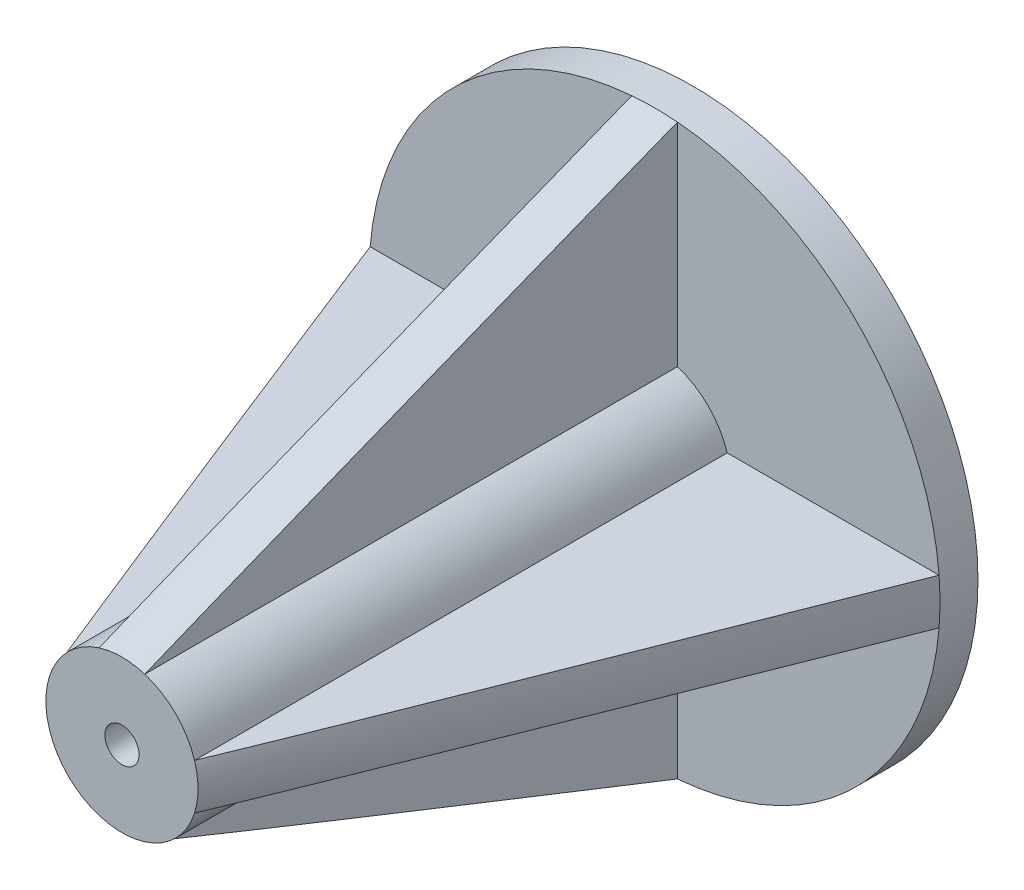
ISO-10303-21;
HEADER;
FILE_DESCRIPTION(('STEP AP214'),'2;1');
FILE_NAME('part.step','',(''),(''),'','','');
FILE_SCHEMA(('AUTOMOTIVE_DESIGN { 1 0 10303 214 1 1 1 1 }'));
ENDSEC;
DATA;
#1=APPLICATION_CONTEXT('core data for automotive mechanical design processes');
#2=APPLICATION_PROTOCOL_DEFINITION('international standard','automotive_design',2000,#1);
#3=PRODUCT_CONTEXT('',#1,'mechanical');
#4=PRODUCT('Part','Part','',(#3));
#5=PRODUCT_RELATED_PRODUCT_CATEGORY('part','',(#4));
#6=PRODUCT_DEFINITION_FORMATION('','',#4);
#7=PRODUCT_DEFINITION_CONTEXT('part definition',#1,'design');
#8=PRODUCT_DEFINITION('design','',#6,#7);
#9=PRODUCT_DEFINITION_SHAPE('','',#8);
#10=(LENGTH_UNIT() NAMED_UNIT(*) SI_UNIT(.MILLI.,.METRE.));
#11=(NAMED_UNIT(*) PLANE_ANGLE_UNIT() SI_UNIT($,.RADIAN.));
#12=(NAMED_UNIT(*) SI_UNIT($,.STERADIAN.) SOLID_ANGLE_UNIT());
#13=UNCERTAINTY_MEASURE_WITH_UNIT(LENGTH_MEASURE(1.E-05),#10,'distance_accuracy_value','');
#14=(GEOMETRIC_REPRESENTATION_CONTEXT(3) GLOBAL_UNCERTAINTY_ASSIGNED_CONTEXT((#13)) GLOBAL_UNIT_ASSIGNED_CONTEXT((#10,
#11,#12)) REPRESENTATION_CONTEXT('',''));
#15=CARTESIAN_POINT('',(0.,0.,0.));
#16=DIRECTION('',(0.,0.,1.));
#17=DIRECTION('',(1.,0.,0.));
#18=AXIS2_PLACEMENT_3D('',#15,#16,#17);
#19=CARTESIAN_POINT('',(0.,0.,2.));
#20=DIRECTION('',(0.,0.,1.));
#21=DIRECTION('',(1.,0.,0.));
#22=AXIS2_PLACEMENT_3D('',#19,#20,#21);
#23=PLANE('',#22);
#24=CARTESIAN_POINT('',(0.,0.,2.));
#25=DIRECTION('',(0.,0.,1.));
#26=DIRECTION('',(1.,0.,0.));
#27=AXIS2_PLACEMENT_3D('',#24,#25,#26);
#28=CIRCLE('',#27,4.);
#29=CARTESIAN_POINT('',(-1.20000000000005,-3.81575680566777,2.));
#30=VERTEX_POINT('',#29);
#31=CARTESIAN_POINT('',(-3.81575680566778,-1.20000000000001,2.));
#32=VERTEX_POINT('',#31);
#33=EDGE_CURVE('E451',#30,#32,#28,.F.);
#34=ORIENTED_EDGE('',*,*,#33,.T.);
#35=DIRECTION('',(1.,0.,0.));
#36=VECTOR('',#35,1.);
#37=CARTESIAN_POINT('',(0.,-1.19999999999995,2.));
#38=LINE('',#37,#36);
#39=CARTESIAN_POINT('',(-14.9519229532525,-1.20000000000018,2.));
#40=VERTEX_POINT('',#39);
#41=EDGE_CURVE('E184',#40,#32,#38,.T.);
#42=ORIENTED_EDGE('',*,*,#41,.F.);
#43=CARTESIAN_POINT('',(0.,0.,2.));
#44=DIRECTION('',(0.,0.,1.));
#45=DIRECTION('',(1.,0.,0.));
#46=AXIS2_PLACEMENT_3D('',#43,#44,#45);
#47=CIRCLE('',#46,15.);
#48=CARTESIAN_POINT('',(-1.19999999999972,-14.9519229532526,2.));
#49=VERTEX_POINT('',#48);
#50=EDGE_CURVE('E258',#40,#49,#47,.T.);
#51=ORIENTED_EDGE('',*,*,#50,.T.);
#52=DIRECTION('',(0.,1.,0.));
#53=VECTOR('',#52,1.);
#54=CARTESIAN_POINT('',(-1.20000000000016,0.,2.));
#55=LINE('',#54,#53);
#56=EDGE_CURVE('E190',#49,#30,#55,.T.);
#57=ORIENTED_EDGE('',*,*,#56,.T.);
#58=EDGE_LOOP('',(#34,#42,#51,#57));
#59=FACE_BOUND('',#58,.T.);
#60=ADVANCED_FACE('F53',(#59),#23,.T.);
#61=CARTESIAN_POINT('',(0.,0.,30.));
#62=DIRECTION('',(0.,0.,-1.));
#63=DIRECTION('',(-1.,0.,0.));
#64=AXIS2_PLACEMENT_3D('',#61,#62,#63);
#65=CYLINDRICAL_SURFACE('',#64,4.);
#66=DIRECTION('',(0.,0.,-1.));
#67=VECTOR('',#66,1.);
#68=CARTESIAN_POINT('',(-3.81575680566778,-1.20000000000001,41.4388502844459));
#69=LINE('',#68,#67);
#70=CARTESIAN_POINT('',(-3.81575680566778,-1.20000000000001,30.));
#71=VERTEX_POINT('',#70);
#72=EDGE_CURVE('E175',#71,#32,#69,.T.);
#73=ORIENTED_EDGE('',*,*,#72,.T.);
#74=ORIENTED_EDGE('',*,*,#33,.F.);
#75=DIRECTION('',(0.,0.,-1.));
#76=VECTOR('',#75,1.);
#77=CARTESIAN_POINT('',(-1.20000000000005,-3.81575680566777,41.4388502844459));
#78=LINE('',#77,#76);
#79=CARTESIAN_POINT('',(-1.20000000000005,-3.81575680566777,30.));
#80=VERTEX_POINT('',#79);
#81=EDGE_CURVE('E178',#80,#30,#78,.T.);
#82=ORIENTED_EDGE('',*,*,#81,.F.);
#83=CARTESIAN_POINT('',(0.,0.,30.));
#84=DIRECTION('',(0.,0.,1.));
#85=DIRECTION('',(1.,0.,0.));
#86=AXIS2_PLACEMENT_3D('',#83,#84,#85);
#87=CIRCLE('',#86,4.);
#88=EDGE_CURVE('E164',#71,#80,#87,.T.);
#89=ORIENTED_EDGE('',*,*,#88,.F.);
#90=EDGE_LOOP('',(#73,#74,#82,#89));
#91=FACE_BOUND('',#90,.T.);
#92=ADVANCED_FACE('F173',(#91),#65,.T.);
#93=CARTESIAN_POINT('',(3.81575680566777,-1.20000000000005,2.));
#94=VERTEX_POINT('',#93);
#95=CARTESIAN_POINT('',(1.19999999999995,-3.8157568056678,2.));
#96=VERTEX_POINT('',#95);
#97=EDGE_CURVE('E249',#94,#96,#28,.F.);
#98=ORIENTED_EDGE('',*,*,#97,.T.);
#99=DIRECTION('',(0.,1.,0.));
#100=VECTOR('',#99,1.);
#101=CARTESIAN_POINT('',(1.19999999999984,0.,2.));
#102=LINE('',#101,#100);
#103=CARTESIAN_POINT('',(1.20000000000028,-14.9519229532525,2.));
#104=VERTEX_POINT('',#103);
#105=EDGE_CURVE('E199',#104,#96,#102,.T.);
#106=ORIENTED_EDGE('',*,*,#105,.F.);
#107=CARTESIAN_POINT('',(14.9519229532525,-1.20000000000005,2.));
#108=VERTEX_POINT('',#107);
#109=EDGE_CURVE('E427',#104,#108,#47,.T.);
#110=ORIENTED_EDGE('',*,*,#109,.T.);
#111=DIRECTION('',(-1.,0.,0.));
#112=VECTOR('',#111,1.);
#113=CARTESIAN_POINT('',(0.,-1.20000000000005,2.));
#114=LINE('',#113,#112);
#115=EDGE_CURVE('E203',#108,#94,#114,.T.);
#116=ORIENTED_EDGE('',*,*,#115,.T.);
#117=EDGE_LOOP('',(#98,#106,#110,#116));
#118=FACE_BOUND('',#117,.T.);
#119=ADVANCED_FACE('F357',(#118),#23,.T.);
#120=DIRECTION('',(0.,0.,-1.));
#121=VECTOR('',#120,1.);
#122=CARTESIAN_POINT('',(1.19999999999996,-3.8157568056678,41.4388502844459));
#123=LINE('',#122,#121);
#124=CARTESIAN_POINT('',(1.19999999999996,-3.8157568056678,30.));
#125=VERTEX_POINT('',#124);
#126=EDGE_CURVE('E204',#125,#96,#123,.T.);
#127=ORIENTED_EDGE('',*,*,#126,.T.);
#128=ORIENTED_EDGE('',*,*,#97,.F.);
#129=DIRECTION('',(0.,0.,-1.));
#130=VECTOR('',#129,1.);
#131=CARTESIAN_POINT('',(3.81575680566777,-1.20000000000005,41.4388502844459));
#132=LINE('',#131,#130);
#133=CARTESIAN_POINT('',(3.81575680566777,-1.20000000000005,30.));
#134=VERTEX_POINT('',#133);
#135=EDGE_CURVE('E211',#134,#94,#132,.T.);
#136=ORIENTED_EDGE('',*,*,#135,.F.);
#137=EDGE_CURVE('E181',#125,#134,#87,.T.);
#138=ORIENTED_EDGE('',*,*,#137,.F.);
#139=EDGE_LOOP('',(#127,#128,#136,#138));
#140=FACE_BOUND('',#139,.T.);
#141=ADVANCED_FACE('F361',(#140),#65,.T.);
#142=CARTESIAN_POINT('',(1.2,3.81575680566778,2.));
#143=VERTEX_POINT('',#142);
#144=CARTESIAN_POINT('',(3.8157568056678,1.19999999999995,2.));
#145=VERTEX_POINT('',#144);
#146=EDGE_CURVE('E244',#143,#145,#28,.F.);
#147=ORIENTED_EDGE('',*,*,#146,.T.);
#148=DIRECTION('',(-1.,0.,0.));
#149=VECTOR('',#148,1.);
#150=CARTESIAN_POINT('',(0.,1.19999999999995,2.));
#151=LINE('',#150,#149);
#152=CARTESIAN_POINT('',(14.9519229532525,1.19999999999995,2.));
#153=VERTEX_POINT('',#152);
#154=EDGE_CURVE('E212',#153,#145,#151,.T.);
#155=ORIENTED_EDGE('',*,*,#154,.F.);
#156=CARTESIAN_POINT('',(1.2,14.9519229532525,2.));
#157=VERTEX_POINT('',#156);
#158=EDGE_CURVE('E259',#153,#157,#47,.T.);
#159=ORIENTED_EDGE('',*,*,#158,.T.);
#160=DIRECTION('',(0.,-1.,0.));
#161=VECTOR('',#160,1.);
#162=CARTESIAN_POINT('',(1.2,0.,2.));
#163=LINE('',#162,#161);
#164=EDGE_CURVE('E228',#157,#143,#163,.T.);
#165=ORIENTED_EDGE('',*,*,#164,.T.);
#166=EDGE_LOOP('',(#147,#155,#159,#165));
#167=FACE_BOUND('',#166,.T.);
#168=ADVANCED_FACE('F348',(#167),#23,.T.);
#169=DIRECTION('',(0.,0.,-1.));
#170=VECTOR('',#169,1.);
#171=CARTESIAN_POINT('',(3.8157568056678,1.19999999999995,41.4388502844459));
#172=LINE('',#171,#170);
#173=CARTESIAN_POINT('',(3.8157568056678,1.19999999999995,30.));
#174=VERTEX_POINT('',#173);
#175=EDGE_CURVE('E217',#174,#145,#172,.T.);
#176=ORIENTED_EDGE('',*,*,#175,.T.);
#177=ORIENTED_EDGE('',*,*,#146,.F.);
#178=DIRECTION('',(0.,0.,-1.));
#179=VECTOR('',#178,1.);
#180=CARTESIAN_POINT('',(1.2,3.81575680566778,41.4388502844459));
#181=LINE('',#180,#179);
#182=CARTESIAN_POINT('',(1.2,3.81575680566778,30.));
#183=VERTEX_POINT('',#182);
#184=EDGE_CURVE('E216',#183,#143,#181,.T.);
#185=ORIENTED_EDGE('',*,*,#184,.F.);
#186=EDGE_CURVE('E240',#174,#183,#87,.T.);
#187=ORIENTED_EDGE('',*,*,#186,.F.);
#188=EDGE_LOOP('',(#176,#177,#185,#187));
#189=FACE_BOUND('',#188,.T.);
#190=ADVANCED_FACE('F338',(#189),#65,.T.);
#191=DIRECTION('',(1.,0.,0.));
#192=VECTOR('',#191,1.);
#193=CARTESIAN_POINT('',(0.,1.20000000000005,2.));
#194=LINE('',#193,#192);
#195=CARTESIAN_POINT('',(-14.9519229532525,1.19999999999982,2.));
#196=VERTEX_POINT('',#195);
#197=CARTESIAN_POINT('',(-3.81575680566778,1.2,2.));
#198=VERTEX_POINT('',#197);
#199=EDGE_CURVE('E193',#196,#198,#194,.T.);
#200=ORIENTED_EDGE('',*,*,#199,.T.);
#201=CARTESIAN_POINT('',(-1.2,3.81575680566778,2.));
#202=VERTEX_POINT('',#201);
#203=EDGE_CURVE('E243',#198,#202,#28,.F.);
#204=ORIENTED_EDGE('',*,*,#203,.T.);
#205=DIRECTION('',(0.,-1.,0.));
#206=VECTOR('',#205,1.);
#207=CARTESIAN_POINT('',(-1.2,0.,2.));
#208=LINE('',#207,#206);
#209=CARTESIAN_POINT('',(-1.2,14.9519229532525,2.));
#210=VERTEX_POINT('',#209);
#211=EDGE_CURVE('E223',#210,#202,#208,.T.);
#212=ORIENTED_EDGE('',*,*,#211,.F.);
#213=EDGE_CURVE('E254',#210,#196,#47,.T.);
#214=ORIENTED_EDGE('',*,*,#213,.T.);
#215=EDGE_LOOP('',(#200,#204,#212,#214));
#216=FACE_BOUND('',#215,.T.);
#217=ADVANCED_FACE('F343',(#216),#23,.T.);
#218=CARTESIAN_POINT('',(0.,0.,0.));
#219=DIRECTION('',(0.,0.,1.));
#220=DIRECTION('',(1.,0.,0.));
#221=AXIS2_PLACEMENT_3D('',#218,#219,#220);
#222=PLANE('',#221);
#223=CARTESIAN_POINT('',(0.,0.,0.));
#224=DIRECTION('',(0.,0.,1.));
#225=DIRECTION('',(1.,0.,0.));
#226=AXIS2_PLACEMENT_3D('',#223,#224,#225);
#227=CIRCLE('',#226,0.9);
#228=CARTESIAN_POINT('',(0.9,0.,0.));
#229=VERTEX_POINT('',#228);
#230=EDGE_CURVE('E248',#229,#229,#227,.T.);
#231=ORIENTED_EDGE('',*,*,#230,.T.);
#232=EDGE_LOOP('',(#231));
#233=FACE_BOUND('',#232,.T.);
#234=CARTESIAN_POINT('',(0.,0.,0.));
#235=DIRECTION('',(0.,0.,1.));
#236=DIRECTION('',(1.,0.,0.));
#237=AXIS2_PLACEMENT_3D('',#234,#235,#236);
#238=CIRCLE('',#237,15.);
#239=CARTESIAN_POINT('',(15.,0.,0.));
#240=VERTEX_POINT('',#239);
#241=EDGE_CURVE('E253',#240,#240,#238,.T.);
#242=ORIENTED_EDGE('',*,*,#241,.F.);
#243=EDGE_LOOP('',(#242));
#244=FACE_BOUND('',#243,.T.);
#245=ADVANCED_FACE('F346',(#233,#244),#222,.F.);
#246=CARTESIAN_POINT('',(0.,0.,2.));
#247=DIRECTION('',(0.,0.,-1.));
#248=DIRECTION('',(-1.,0.,0.));
#249=AXIS2_PLACEMENT_3D('',#246,#247,#248);
#250=CYLINDRICAL_SURFACE('',#249,15.);
#251=ORIENTED_EDGE('',*,*,#50,.F.);
#252=CARTESIAN_POINT('',(0.,0.,1.99999999999975));
#253=DIRECTION('',(0.,0.,1.));
#254=DIRECTION('',(1.,0.,0.));
#255=AXIS2_PLACEMENT_3D('',#252,#253,#254);
#256=CIRCLE('',#255,15.);
#257=EDGE_CURVE('E83',#40,#196,#256,.F.);
#258=ORIENTED_EDGE('',*,*,#257,.T.);
#259=ORIENTED_EDGE('',*,*,#213,.F.);
#260=CARTESIAN_POINT('',(0.,0.,1.99999999999976));
#261=DIRECTION('',(0.,0.,1.));
#262=DIRECTION('',(1.,0.,0.));
#263=AXIS2_PLACEMENT_3D('',#260,#261,#262);
#264=CIRCLE('',#263,15.);
#265=EDGE_CURVE('E438',#210,#157,#264,.F.);
#266=ORIENTED_EDGE('',*,*,#265,.T.);
#267=ORIENTED_EDGE('',*,*,#158,.F.);
#268=CARTESIAN_POINT('',(0.,0.,1.99999999999975));
#269=DIRECTION('',(0.,0.,1.));
#270=DIRECTION('',(1.,0.,0.));
#271=AXIS2_PLACEMENT_3D('',#268,#269,#270);
#272=CIRCLE('',#271,15.);
#273=EDGE_CURVE('E429',#153,#108,#272,.F.);
#274=ORIENTED_EDGE('',*,*,#273,.T.);
#275=ORIENTED_EDGE('',*,*,#109,.F.);
#276=CARTESIAN_POINT('',(0.,0.,1.99999999999975));
#277=DIRECTION('',(0.,0.,1.));
#278=DIRECTION('',(1.,0.,0.));
#279=AXIS2_PLACEMENT_3D('',#276,#277,#278);
#280=CIRCLE('',#279,15.);
#281=EDGE_CURVE('E155',#104,#49,#280,.F.);
#282=ORIENTED_EDGE('',*,*,#281,.T.);
#283=EDGE_LOOP('',(#251,#258,#259,#266,#267,#274,#275,#282));
#284=FACE_BOUND('',#283,.T.);
#285=ORIENTED_EDGE('',*,*,#241,.T.);
#286=EDGE_LOOP('',(#285));
#287=FACE_BOUND('',#286,.T.);
#288=ADVANCED_FACE('F341',(#284,#287),#250,.T.);
#289=CARTESIAN_POINT('',(0.,0.,2.));
#290=DIRECTION('',(0.,0.,-1.));
#291=DIRECTION('',(-1.,0.,0.));
#292=AXIS2_PLACEMENT_3D('',#289,#290,#291);
#293=CYLINDRICAL_SURFACE('',#292,0.9);
#294=ORIENTED_EDGE('',*,*,#230,.F.);
#295=EDGE_LOOP('',(#294));
#296=FACE_BOUND('',#295,.T.);
#297=CARTESIAN_POINT('',(0.,0.,30.));
#298=DIRECTION('',(0.,0.,1.));
#299=DIRECTION('',(1.,0.,0.));
#300=AXIS2_PLACEMENT_3D('',#297,#298,#299);
#301=CIRCLE('',#300,0.9);
#302=CARTESIAN_POINT('',(0.9,0.,30.));
#303=VERTEX_POINT('',#302);
#304=EDGE_CURVE('E232',#303,#303,#301,.T.);
#305=ORIENTED_EDGE('',*,*,#304,.T.);
#306=EDGE_LOOP('',(#305));
#307=FACE_BOUND('',#306,.T.);
#308=ADVANCED_FACE('F334',(#296,#307),#293,.F.);
#309=CARTESIAN_POINT('',(0.,0.,30.));
#310=DIRECTION('',(0.,0.,1.));
#311=DIRECTION('',(1.,0.,0.));
#312=AXIS2_PLACEMENT_3D('',#309,#310,#311);
#313=PLANE('',#312);
#314=CARTESIAN_POINT('',(-1.2,3.81575680566778,30.));
#315=VERTEX_POINT('',#314);
#316=CARTESIAN_POINT('',(-3.81575680566778,1.2,30.));
#317=VERTEX_POINT('',#316);
#318=EDGE_CURVE('E168',#315,#317,#87,.T.);
#319=ORIENTED_EDGE('',*,*,#318,.T.);
#320=CARTESIAN_POINT('',(0.,0.,30.));
#321=DIRECTION('',(0.,0.,1.));
#322=DIRECTION('',(1.,0.,0.));
#323=AXIS2_PLACEMENT_3D('',#320,#321,#322);
#324=CIRCLE('',#323,3.99999999999999);
#325=EDGE_CURVE('E153',#317,#71,#324,.T.);
#326=ORIENTED_EDGE('',*,*,#325,.T.);
#327=ORIENTED_EDGE('',*,*,#88,.T.);
#328=CARTESIAN_POINT('',(0.,0.,30.));
#329=DIRECTION('',(0.,0.,1.));
#330=DIRECTION('',(1.,0.,0.));
#331=AXIS2_PLACEMENT_3D('',#328,#329,#330);
#332=CIRCLE('',#331,3.99999999999999);
#333=EDGE_CURVE('E257',#80,#125,#332,.T.);
#334=ORIENTED_EDGE('',*,*,#333,.T.);
#335=ORIENTED_EDGE('',*,*,#137,.T.);
#336=CARTESIAN_POINT('',(0.,0.,30.));
#337=DIRECTION('',(0.,0.,1.));
#338=DIRECTION('',(1.,0.,0.));
#339=AXIS2_PLACEMENT_3D('',#336,#337,#338);
#340=CIRCLE('',#339,3.99999999999999);
#341=EDGE_CURVE('E265',#134,#174,#340,.T.);
#342=ORIENTED_EDGE('',*,*,#341,.T.);
#343=ORIENTED_EDGE('',*,*,#186,.T.);
#344=CARTESIAN_POINT('',(0.,0.,30.));
#345=DIRECTION('',(0.,0.,1.));
#346=DIRECTION('',(1.,0.,0.));
#347=AXIS2_PLACEMENT_3D('',#344,#345,#346);
#348=CIRCLE('',#347,3.99999999999999);
#349=EDGE_CURVE('E170',#183,#315,#348,.T.);
#350=ORIENTED_EDGE('',*,*,#349,.T.);
#351=EDGE_LOOP('',(#319,#326,#327,#334,#335,#342,#343,#350));
#352=FACE_BOUND('',#351,.T.);
#353=ORIENTED_EDGE('',*,*,#304,.F.);
#354=EDGE_LOOP('',(#353));
#355=FACE_BOUND('',#354,.T.);
#356=ADVANCED_FACE('F161',(#352,#355),#313,.T.);
#357=ORIENTED_EDGE('',*,*,#203,.F.);
#358=DIRECTION('',(0.,0.,-1.));
#359=VECTOR('',#358,1.);
#360=CARTESIAN_POINT('',(-3.81575680566778,1.2,41.4388502844459));
#361=LINE('',#360,#359);
#362=EDGE_CURVE('E186',#317,#198,#361,.T.);
#363=ORIENTED_EDGE('',*,*,#362,.F.);
#364=ORIENTED_EDGE('',*,*,#318,.F.);
#365=DIRECTION('',(0.,0.,-1.));
#366=VECTOR('',#365,1.);
#367=CARTESIAN_POINT('',(-1.2,3.81575680566778,41.4388502844459));
#368=LINE('',#367,#366);
#369=EDGE_CURVE('E227',#315,#202,#368,.T.);
#370=ORIENTED_EDGE('',*,*,#369,.T.);
#371=EDGE_LOOP('',(#357,#363,#364,#370));
#372=FACE_BOUND('',#371,.T.);
#373=ADVANCED_FACE('F330',(#372),#65,.T.);
#374=CARTESIAN_POINT('',(1.2,0.,41.4388502844459));
#375=DIRECTION('',(1.,0.,0.));
#376=DIRECTION('',(0.,1.,0.));
#377=AXIS2_PLACEMENT_3D('',#374,#375,#376);
#378=PLANE('',#377);
#379=ORIENTED_EDGE('',*,*,#164,.F.);
#380=CARTESIAN_POINT('',(1.2,14.9519229532525,1.99999999999976));
#381=CARTESIAN_POINT('',(1.2,14.6163003345625,2.85157027897511));
#382=CARTESIAN_POINT('',(1.2,14.2806176876375,3.70311690714339));
#383=CARTESIAN_POINT('',(1.2,13.6090972750942,5.40614906127465));
#384=CARTESIAN_POINT('',(1.2,13.273259509466,6.25763458723367));
#385=CARTESIAN_POINT('',(1.2,12.2654601094663,8.81198091881154));
#386=CARTESIAN_POINT('',(1.2,11.5932132678537,10.5147292044953));
#387=CARTESIAN_POINT('',(1.2,10.2475033566,13.9197096144564));
#388=CARTESIAN_POINT('',(1.2,9.57404030931954,15.621941747565));
#389=CARTESIAN_POINT('',(1.2,8.56212198065222,18.1746069061333));
#390=CARTESIAN_POINT('',(1.2,8.22452854899887,19.0253815253596));
#391=CARTESIAN_POINT('',(1.2,7.54850542578913,20.7265984279276));
#392=CARTESIAN_POINT('',(1.2,7.2100757344066,21.5770407113384));
#393=CARTESIAN_POINT('',(1.2,6.6189390703452,23.0593101297939));
#394=CARTESIAN_POINT('',(1.2,6.36651422146482,23.6912497562663));
#395=CARTESIAN_POINT('',(1.2,5.86067799920109,24.9547329462278));
#396=CARTESIAN_POINT('',(1.2,5.60726662777558,25.5862765104999));
#397=CARTESIAN_POINT('',(1.2,5.22604591178395,26.5331506728488));
#398=CARTESIAN_POINT('',(1.2,5.09878785664029,26.848703195251));
#399=CARTESIAN_POINT('',(1.2,4.84380859880849,27.4796208749484));
#400=CARTESIAN_POINT('',(1.2,4.71608739641133,27.7949860323613));
#401=CARTESIAN_POINT('',(1.2,4.46006288437059,28.4254824089011));
#402=CARTESIAN_POINT('',(1.2,4.33175957116302,28.740613626582));
#403=CARTESIAN_POINT('',(1.2,4.07438283214488,29.3705621244158));
#404=CARTESIAN_POINT('',(1.2,3.94530940466782,29.6853794038876));
#405=CARTESIAN_POINT('',(1.2,3.81575680566778,30.));
#406=B_SPLINE_CURVE_WITH_KNOTS('',3,(#380,#381,#382,#383,#384,#385,#386,#387,#388,#389,#390,
#391,#392,#393,#394,#395,#396,#397,#398,#399,#400,#401,#402,#403,#404,#405),.UNSPECIFIED.,.F.,
.F.,(4,2,2,2,2,2,2,2,2,2,2,2,4),(0.,2.74596620263479,5.49193258298164,10.9838726749836,
16.4757128014728,19.2216333375455,21.967553302778,24.0090214032166,26.0504854542523,
27.0712261051837,28.0919661149242,29.1127123826322,30.1334608600171),.UNSPECIFIED.);
#407=EDGE_CURVE('E309',#157,#183,#406,.T.);
#408=ORIENTED_EDGE('',*,*,#407,.T.);
#409=ORIENTED_EDGE('',*,*,#184,.T.);
#410=EDGE_LOOP('',(#379,#408,#409));
#411=FACE_BOUND('',#410,.T.);
#412=ADVANCED_FACE('F323',(#411),#378,.T.);
#413=CARTESIAN_POINT('',(-1.2,0.,41.4388502844459));
#414=DIRECTION('',(1.,0.,0.));
#415=DIRECTION('',(0.,1.,0.));
#416=AXIS2_PLACEMENT_3D('',#413,#414,#415);
#417=PLANE('',#416);
#418=ORIENTED_EDGE('',*,*,#369,.F.);
#419=CARTESIAN_POINT('',(-1.2,3.81575680566778,30.));
#420=CARTESIAN_POINT('',(-1.2,3.90870204758805,29.7742979709762));
#421=CARTESIAN_POINT('',(-1.2,4.00139421961801,29.5484919422507));
#422=CARTESIAN_POINT('',(-1.2,4.18635183856787,29.0967054712004));
#423=CARTESIAN_POINT('',(-1.2,4.27861728599473,28.870725029083));
#424=CARTESIAN_POINT('',(-1.2,4.55489219450225,28.192573617164));
#425=CARTESIAN_POINT('',(-1.2,4.73838102673391,27.7401906032426));
#426=CARTESIAN_POINT('',(-1.2,5.28741205487808,26.3824682525542));
#427=CARTESIAN_POINT('',(-1.2,5.6515211205734,25.4765498938133));
#428=CARTESIAN_POINT('',(-1.2,6.39071206814626,23.6312903710657));
#429=CARTESIAN_POINT('',(-1.2,6.76571772167417,22.6919187303557));
#430=CARTESIAN_POINT('',(-1.2,7.51436266475533,20.8126308677113));
#431=CARTESIAN_POINT('',(-1.2,7.88800195377622,19.8727146455648));
#432=CARTESIAN_POINT('',(-1.2,8.63439611803481,17.9925293103559));
#433=CARTESIAN_POINT('',(-1.2,9.00715099166716,17.0522601966563));
#434=CARTESIAN_POINT('',(-1.2,9.7520495843931,15.1714798847074));
#435=CARTESIAN_POINT('',(-1.2,10.1241933034453,14.2309686864416));
#436=CARTESIAN_POINT('',(-1.2,11.2400006724184,11.4091297953951));
#437=CARTESIAN_POINT('',(-1.2,11.9830204258279,9.52754752422638));
#438=CARTESIAN_POINT('',(-1.2,13.0968315063791,6.70489638349096));
#439=CARTESIAN_POINT('',(-1.2,13.4679811463843,5.76396882226475));
#440=CARTESIAN_POINT('',(-1.2,14.2100863676206,3.88203730904108));
#441=CARTESIAN_POINT('',(-1.2,14.5810419488757,2.94103335705309));
#442=CARTESIAN_POINT('',(-1.2,14.9519229532525,1.99999999999976));
#443=B_SPLINE_CURVE_WITH_KNOTS('',3,(#419,#420,#421,#422,#423,#424,#425,#426,#427,#428,#429,
#430,#431,#432,#433,#434,#435,#436,#437,#438,#439,#440,#441,#442),.UNSPECIFIED.,.F.,.F.,(4,2,2,
2,2,2,2,2,2,2,2,4),(0.,0.732271369281103,1.46454186836527,2.92907651404885,5.8581272864134,
8.8925016266659,11.9268771490579,14.961258175109,17.9956394066917,24.0645655457305,
27.0990128711397,30.133459821087),.UNSPECIFIED.);
#444=EDGE_CURVE('E300',#315,#210,#443,.T.);
#445=ORIENTED_EDGE('',*,*,#444,.T.);
#446=ORIENTED_EDGE('',*,*,#211,.T.);
#447=EDGE_LOOP('',(#418,#445,#446));
#448=FACE_BOUND('',#447,.T.);
#449=ADVANCED_FACE('F318',(#448),#417,.F.);
#450=CARTESIAN_POINT('',(0.,-1.20000000000005,41.4388502844459));
#451=DIRECTION('',(0.,-1.,0.));
#452=DIRECTION('',(1.,0.,0.));
#453=AXIS2_PLACEMENT_3D('',#450,#451,#452);
#454=PLANE('',#453);
#455=ORIENTED_EDGE('',*,*,#115,.F.);
#456=CARTESIAN_POINT('',(14.9519229532525,-1.20000000000005,1.99999999999975));
#457=CARTESIAN_POINT('',(14.6163003345625,-1.20000000000005,2.8515702789751));
#458=CARTESIAN_POINT('',(14.2806176876375,-1.20000000000005,3.70311690714338));
#459=CARTESIAN_POINT('',(13.6090972750942,-1.20000000000005,5.40614906127465));
#460=CARTESIAN_POINT('',(13.273259509466,-1.20000000000005,6.25763458723367));
#461=CARTESIAN_POINT('',(12.2654601094663,-1.20000000000005,8.81198091881153));
#462=CARTESIAN_POINT('',(11.5932132678537,-1.20000000000005,10.5147292044952));
#463=CARTESIAN_POINT('',(10.2475033565999,-1.20000000000005,13.9197096144564));
#464=CARTESIAN_POINT('',(9.57404030931953,-1.20000000000005,15.621941747565));
#465=CARTESIAN_POINT('',(8.56212198065222,-1.20000000000005,18.1746069061333));
#466=CARTESIAN_POINT('',(8.22452854899887,-1.20000000000005,19.0253815253596));
#467=CARTESIAN_POINT('',(7.54850542578912,-1.20000000000005,20.7265984279276));
#468=CARTESIAN_POINT('',(7.21007573440659,-1.20000000000005,21.5770407113384));
#469=CARTESIAN_POINT('',(6.61893907034519,-1.20000000000005,23.0593101297939));
#470=CARTESIAN_POINT('',(6.36651422146481,-1.20000000000005,23.6912497562663));
#471=CARTESIAN_POINT('',(5.86067799920108,-1.20000000000005,24.9547329462278));
#472=CARTESIAN_POINT('',(5.60726662777557,-1.20000000000005,25.5862765104999));
#473=CARTESIAN_POINT('',(5.22604591178394,-1.20000000000005,26.5331506728488));
#474=CARTESIAN_POINT('',(5.09878785664028,-1.20000000000005,26.848703195251));
#475=CARTESIAN_POINT('',(4.84380859880848,-1.20000000000005,27.4796208749484));
#476=CARTESIAN_POINT('',(4.71608739641132,-1.20000000000005,27.7949860323613));
#477=CARTESIAN_POINT('',(4.46006288437058,-1.20000000000005,28.4254824089011));
#478=CARTESIAN_POINT('',(4.331759571163,-1.20000000000005,28.740613626582));
#479=CARTESIAN_POINT('',(4.07438283214487,-1.20000000000005,29.3705621244158));
#480=CARTESIAN_POINT('',(3.9453094046678,-1.20000000000005,29.6853794038876));
#481=CARTESIAN_POINT('',(3.81575680566776,-1.20000000000005,30.));
#482=B_SPLINE_CURVE_WITH_KNOTS('',3,(#456,#457,#458,#459,#460,#461,#462,#463,#464,#465,#466,
#467,#468,#469,#470,#471,#472,#473,#474,#475,#476,#477,#478,#479,#480,#481),.UNSPECIFIED.,.F.,
.F.,(4,2,2,2,2,2,2,2,2,2,2,2,4),(0.,2.74596620263479,5.49193258298164,10.9838726749836,
16.4757128014728,19.2216333375455,21.967553302778,24.0090214032166,26.0504854542523,
27.0712261051837,28.0919661149242,29.1127123826322,30.1334608600171),.UNSPECIFIED.);
#483=EDGE_CURVE('E389',#108,#134,#482,.T.);
#484=ORIENTED_EDGE('',*,*,#483,.T.);
#485=ORIENTED_EDGE('',*,*,#135,.T.);
#486=EDGE_LOOP('',(#455,#484,#485));
#487=FACE_BOUND('',#486,.T.);
#488=ADVANCED_FACE('F322',(#487),#454,.T.);
#489=CARTESIAN_POINT('',(0.,1.19999999999995,41.4388502844459));
#490=DIRECTION('',(0.,-1.,0.));
#491=DIRECTION('',(1.,0.,0.));
#492=AXIS2_PLACEMENT_3D('',#489,#490,#491);
#493=PLANE('',#492);
#494=ORIENTED_EDGE('',*,*,#175,.F.);
#495=CARTESIAN_POINT('',(3.81575680566779,1.19999999999995,30.));
#496=CARTESIAN_POINT('',(3.90870204758806,1.19999999999995,29.7742979709762));
#497=CARTESIAN_POINT('',(4.00139421961803,1.19999999999995,29.5484919422507));
#498=CARTESIAN_POINT('',(4.18635183856789,1.19999999999995,29.0967054712004));
#499=CARTESIAN_POINT('',(4.27861728599475,1.19999999999995,28.870725029083));
#500=CARTESIAN_POINT('',(4.55489219450226,1.19999999999995,28.192573617164));
#501=CARTESIAN_POINT('',(4.73838102673393,1.19999999999995,27.7401906032426));
#502=CARTESIAN_POINT('',(5.28741205487809,1.19999999999995,26.3824682525542));
#503=CARTESIAN_POINT('',(5.65152112057341,1.19999999999995,25.4765498938133));
#504=CARTESIAN_POINT('',(6.39071206814628,1.19999999999995,23.6312903710657));
#505=CARTESIAN_POINT('',(6.76571772167418,1.19999999999995,22.6919187303557));
#506=CARTESIAN_POINT('',(7.51436266475534,1.19999999999995,20.8126308677113));
#507=CARTESIAN_POINT('',(7.88800195377623,1.19999999999995,19.8727146455648));
#508=CARTESIAN_POINT('',(8.63439611803482,1.19999999999995,17.9925293103558));
#509=CARTESIAN_POINT('',(9.00715099166717,1.19999999999995,17.0522601966563));
#510=CARTESIAN_POINT('',(9.75204958439311,1.19999999999995,15.1714798847074));
#511=CARTESIAN_POINT('',(10.1241933034453,1.19999999999995,14.2309686864416));
#512=CARTESIAN_POINT('',(11.2400006724184,1.19999999999995,11.4091297953951));
#513=CARTESIAN_POINT('',(11.9830204258279,1.19999999999995,9.52754752422637));
#514=CARTESIAN_POINT('',(13.0968315063791,1.19999999999995,6.70489638349096));
#515=CARTESIAN_POINT('',(13.4679811463843,1.19999999999995,5.76396882226475));
#516=CARTESIAN_POINT('',(14.2100863676206,1.19999999999995,3.88203730904108));
#517=CARTESIAN_POINT('',(14.5810419488757,1.19999999999995,2.94103335705308));
#518=CARTESIAN_POINT('',(14.9519229532525,1.19999999999995,1.99999999999975));
#519=B_SPLINE_CURVE_WITH_KNOTS('',3,(#495,#496,#497,#498,#499,#500,#501,#502,#503,#504,#505,
#506,#507,#508,#509,#510,#511,#512,#513,#514,#515,#516,#517,#518),.UNSPECIFIED.,.F.,.F.,(4,2,2,
2,2,2,2,2,2,2,2,4),(0.,0.732271369281103,1.46454186836527,2.92907651404885,5.8581272864134,
8.8925016266659,11.9268771490579,14.961258175109,17.9956394066917,24.0645655457305,
27.0990128711397,30.133459821087),.UNSPECIFIED.);
#520=EDGE_CURVE('E384',#174,#153,#519,.T.);
#521=ORIENTED_EDGE('',*,*,#520,.T.);
#522=ORIENTED_EDGE('',*,*,#154,.T.);
#523=EDGE_LOOP('',(#494,#521,#522));
#524=FACE_BOUND('',#523,.T.);
#525=ADVANCED_FACE('F383',(#524),#493,.F.);
#526=CARTESIAN_POINT('',(-1.20000000000016,0.,41.4388502844459));
#527=DIRECTION('',(-1.,0.,0.));
#528=DIRECTION('',(0.,-1.,0.));
#529=AXIS2_PLACEMENT_3D('',#526,#527,#528);
#530=PLANE('',#529);
#531=ORIENTED_EDGE('',*,*,#56,.F.);
#532=CARTESIAN_POINT('',(-1.19999999999972,-14.9519229532526,1.99999999999975));
#533=CARTESIAN_POINT('',(-1.19999999999973,-14.6163003345626,2.8515702789751));
#534=CARTESIAN_POINT('',(-1.19999999999974,-14.2806176876375,3.70311690714338));
#535=CARTESIAN_POINT('',(-1.19999999999976,-13.6090972750942,5.40614906127465));
#536=CARTESIAN_POINT('',(-1.19999999999977,-13.273259509466,6.25763458723367));
#537=CARTESIAN_POINT('',(-1.1999999999998,-12.2654601094663,8.81198091881153));
#538=CARTESIAN_POINT('',(-1.19999999999982,-11.5932132678537,10.5147292044952));
#539=CARTESIAN_POINT('',(-1.19999999999986,-10.2475033566,13.9197096144564));
#540=CARTESIAN_POINT('',(-1.19999999999988,-9.57404030931956,15.621941747565));
#541=CARTESIAN_POINT('',(-1.19999999999991,-8.56212198065224,18.1746069061333));
#542=CARTESIAN_POINT('',(-1.19999999999992,-8.22452854899889,19.0253815253596));
#543=CARTESIAN_POINT('',(-1.19999999999994,-7.54850542578914,20.7265984279276));
#544=CARTESIAN_POINT('',(-1.19999999999995,-7.21007573440662,21.5770407113384));
#545=CARTESIAN_POINT('',(-1.19999999999997,-6.61893907034521,23.0593101297938));
#546=CARTESIAN_POINT('',(-1.19999999999997,-6.36651422146482,23.6912497562663));
#547=CARTESIAN_POINT('',(-1.19999999999999,-5.86067799920109,24.9547329462278));
#548=CARTESIAN_POINT('',(-1.19999999999999,-5.60726662777558,25.5862765104999));
#549=CARTESIAN_POINT('',(-1.20000000000001,-5.22604591178395,26.5331506728488));
#550=CARTESIAN_POINT('',(-1.20000000000001,-5.09878785664029,26.848703195251));
#551=CARTESIAN_POINT('',(-1.20000000000002,-4.84380859880849,27.4796208749484));
#552=CARTESIAN_POINT('',(-1.20000000000002,-4.71608739641133,27.7949860323613));
#553=CARTESIAN_POINT('',(-1.20000000000003,-4.46006288437058,28.4254824089011));
#554=CARTESIAN_POINT('',(-1.20000000000003,-4.33175957116301,28.740613626582));
#555=CARTESIAN_POINT('',(-1.20000000000004,-4.07438283214487,29.3705621244158));
#556=CARTESIAN_POINT('',(-1.20000000000004,-3.9453094046678,29.6853794038876));
#557=CARTESIAN_POINT('',(-1.20000000000005,-3.81575680566776,30.));
#558=B_SPLINE_CURVE_WITH_KNOTS('',3,(#532,#533,#534,#535,#536,#537,#538,#539,#540,#541,#542,
#543,#544,#545,#546,#547,#548,#549,#550,#551,#552,#553,#554,#555,#556,#557),.UNSPECIFIED.,.F.,
.F.,(4,2,2,2,2,2,2,2,2,2,2,2,4),(0.,2.74596620263479,5.49193258298164,10.9838726749836,
16.4757128014728,19.2216333375455,21.9675533027779,24.0090214032166,26.0504854542523,
27.0712261051837,28.0919661149242,29.1127123826322,30.1334608600171),.UNSPECIFIED.);
#559=EDGE_CURVE('E12',#49,#80,#558,.T.);
#560=ORIENTED_EDGE('',*,*,#559,.T.);
#561=ORIENTED_EDGE('',*,*,#81,.T.);
#562=EDGE_LOOP('',(#531,#560,#561));
#563=FACE_BOUND('',#562,.T.);
#564=ADVANCED_FACE('F405',(#563),#530,.T.);
#565=CARTESIAN_POINT('',(1.19999999999984,0.,41.4388502844459));
#566=DIRECTION('',(-1.,0.,0.));
#567=DIRECTION('',(0.,-1.,0.));
#568=AXIS2_PLACEMENT_3D('',#565,#566,#567);
#569=PLANE('',#568);
#570=ORIENTED_EDGE('',*,*,#126,.F.);
#571=CARTESIAN_POINT('',(1.19999999999996,-3.81575680566779,30.));
#572=CARTESIAN_POINT('',(1.19999999999996,-3.90870204758806,29.7742979709762));
#573=CARTESIAN_POINT('',(1.19999999999996,-4.00139421961803,29.5484919422507));
#574=CARTESIAN_POINT('',(1.19999999999997,-4.18635183856788,29.0967054712004));
#575=CARTESIAN_POINT('',(1.19999999999997,-4.27861728599474,28.870725029083));
#576=CARTESIAN_POINT('',(1.19999999999998,-4.55489219450225,28.192573617164));
#577=CARTESIAN_POINT('',(1.19999999999998,-4.73838102673392,27.7401906032426));
#578=CARTESIAN_POINT('',(1.2,-5.28741205487808,26.3824682525542));
#579=CARTESIAN_POINT('',(1.20000000000001,-5.6515211205734,25.4765498938133));
#580=CARTESIAN_POINT('',(1.20000000000003,-6.39071206814626,23.6312903710657));
#581=CARTESIAN_POINT('',(1.20000000000004,-6.76571772167416,22.6919187303557));
#582=CARTESIAN_POINT('',(1.20000000000006,-7.51436266475532,20.8126308677113));
#583=CARTESIAN_POINT('',(1.20000000000007,-7.88800195377621,19.8727146455648));
#584=CARTESIAN_POINT('',(1.20000000000009,-8.6343961180348,17.9925293103558));
#585=CARTESIAN_POINT('',(1.20000000000011,-9.00715099166715,17.0522601966563));
#586=CARTESIAN_POINT('',(1.20000000000013,-9.75204958439309,15.1714798847074));
#587=CARTESIAN_POINT('',(1.20000000000014,-10.1241933034453,14.2309686864416));
#588=CARTESIAN_POINT('',(1.20000000000017,-11.2400006724184,11.4091297953951));
#589=CARTESIAN_POINT('',(1.20000000000019,-11.9830204258278,9.52754752422637));
#590=CARTESIAN_POINT('',(1.20000000000022,-13.0968315063791,6.70489638349095));
#591=CARTESIAN_POINT('',(1.20000000000023,-13.4679811463843,5.76396882226474));
#592=CARTESIAN_POINT('',(1.20000000000026,-14.2100863676205,3.88203730904107));
#593=CARTESIAN_POINT('',(1.20000000000027,-14.5810419488756,2.94103335705308));
#594=CARTESIAN_POINT('',(1.20000000000028,-14.9519229532525,1.99999999999975));
#595=B_SPLINE_CURVE_WITH_KNOTS('',3,(#571,#572,#573,#574,#575,#576,#577,#578,#579,#580,#581,
#582,#583,#584,#585,#586,#587,#588,#589,#590,#591,#592,#593,#594),.UNSPECIFIED.,.F.,.F.,(4,2,2,
2,2,2,2,2,2,2,2,4),(0.,0.732271369281102,1.46454186836527,2.92907651404885,5.8581272864134,
8.89250162666591,11.9268771490579,14.961258175109,17.9956394066917,24.0645655457305,
27.0990128711397,30.133459821087),.UNSPECIFIED.);
#596=EDGE_CURVE('E68',#125,#104,#595,.T.);
#597=ORIENTED_EDGE('',*,*,#596,.T.);
#598=ORIENTED_EDGE('',*,*,#105,.T.);
#599=EDGE_LOOP('',(#570,#597,#598));
#600=FACE_BOUND('',#599,.T.);
#601=ADVANCED_FACE('F288',(#600),#569,.F.);
#602=CARTESIAN_POINT('',(0.,1.20000000000005,41.4388502844459));
#603=DIRECTION('',(0.,1.,0.));
#604=DIRECTION('',(-1.,0.,0.));
#605=AXIS2_PLACEMENT_3D('',#602,#603,#604);
#606=PLANE('',#605);
#607=ORIENTED_EDGE('',*,*,#199,.F.);
#608=CARTESIAN_POINT('',(-14.9519229532525,1.19999999999982,1.99999999999975));
#609=CARTESIAN_POINT('',(-14.6163003345626,1.19999999999983,2.8515702789751));
#610=CARTESIAN_POINT('',(-14.2806176876375,1.19999999999983,3.70311690714339));
#611=CARTESIAN_POINT('',(-13.6090972750942,1.19999999999984,5.40614906127465));
#612=CARTESIAN_POINT('',(-13.273259509466,1.19999999999985,6.25763458723367));
#613=CARTESIAN_POINT('',(-12.2654601094663,1.19999999999986,8.81198091881153));
#614=CARTESIAN_POINT('',(-11.5932132678537,1.19999999999988,10.5147292044952));
#615=CARTESIAN_POINT('',(-10.2475033566,1.1999999999999,13.9197096144564));
#616=CARTESIAN_POINT('',(-9.57404030931955,1.19999999999991,15.621941747565));
#617=CARTESIAN_POINT('',(-8.56212198065223,1.19999999999992,18.1746069061333));
#618=CARTESIAN_POINT('',(-8.22452854899888,1.19999999999993,19.0253815253596));
#619=CARTESIAN_POINT('',(-7.54850542578914,1.19999999999994,20.7265984279276));
#620=CARTESIAN_POINT('',(-7.21007573440661,1.19999999999994,21.5770407113384));
#621=CARTESIAN_POINT('',(-6.61893907034521,1.19999999999995,23.0593101297939));
#622=CARTESIAN_POINT('',(-6.36651422146482,1.19999999999996,23.6912497562663));
#623=CARTESIAN_POINT('',(-5.86067799920109,1.19999999999996,24.9547329462278));
#624=CARTESIAN_POINT('',(-5.60726662777558,1.19999999999997,25.5862765104999));
#625=CARTESIAN_POINT('',(-5.22604591178396,1.19999999999997,26.5331506728488));
#626=CARTESIAN_POINT('',(-5.0987878566403,1.19999999999998,26.848703195251));
#627=CARTESIAN_POINT('',(-4.8438085988085,1.19999999999998,27.4796208749484));
#628=CARTESIAN_POINT('',(-4.71608739641134,1.19999999999998,27.7949860323613));
#629=CARTESIAN_POINT('',(-4.46006288437059,1.19999999999999,28.4254824089011));
#630=CARTESIAN_POINT('',(-4.33175957116302,1.19999999999999,28.740613626582));
#631=CARTESIAN_POINT('',(-4.07438283214488,1.19999999999999,29.3705621244158));
#632=CARTESIAN_POINT('',(-3.94530940466782,1.19999999999999,29.6853794038876));
#633=CARTESIAN_POINT('',(-3.81575680566778,1.2,30.));
#634=B_SPLINE_CURVE_WITH_KNOTS('',3,(#608,#609,#610,#611,#612,#613,#614,#615,#616,#617,#618,
#619,#620,#621,#622,#623,#624,#625,#626,#627,#628,#629,#630,#631,#632,#633),.UNSPECIFIED.,.F.,
.F.,(4,2,2,2,2,2,2,2,2,2,2,2,4),(0.,2.74596620263479,5.49193258298164,10.9838726749836,
16.4757128014728,19.2216333375455,21.967553302778,24.0090214032166,26.0504854542523,
27.0712261051837,28.0919661149242,29.1127123826322,30.1334608600171),.UNSPECIFIED.);
#635=EDGE_CURVE('E292',#196,#317,#634,.T.);
#636=ORIENTED_EDGE('',*,*,#635,.T.);
#637=ORIENTED_EDGE('',*,*,#362,.T.);
#638=EDGE_LOOP('',(#607,#636,#637));
#639=FACE_BOUND('',#638,.T.);
#640=ADVANCED_FACE('F284',(#639),#606,.T.);
#641=CARTESIAN_POINT('',(0.,-1.19999999999995,41.4388502844459));
#642=DIRECTION('',(0.,1.,0.));
#643=DIRECTION('',(-1.,0.,0.));
#644=AXIS2_PLACEMENT_3D('',#641,#642,#643);
#645=PLANE('',#644);
#646=ORIENTED_EDGE('',*,*,#72,.F.);
#647=CARTESIAN_POINT('',(-3.81575680566778,-1.20000000000001,30.));
#648=CARTESIAN_POINT('',(-3.90870204758805,-1.20000000000001,29.7742979709762));
#649=CARTESIAN_POINT('',(-4.00139421961801,-1.20000000000001,29.5484919422507));
#650=CARTESIAN_POINT('',(-4.18635183856787,-1.20000000000001,29.0967054712004));
#651=CARTESIAN_POINT('',(-4.27861728599473,-1.20000000000001,28.870725029083));
#652=CARTESIAN_POINT('',(-4.55489219450224,-1.20000000000002,28.192573617164));
#653=CARTESIAN_POINT('',(-4.73838102673391,-1.20000000000002,27.7401906032426));
#654=CARTESIAN_POINT('',(-5.28741205487808,-1.20000000000003,26.3824682525542));
#655=CARTESIAN_POINT('',(-5.65152112057339,-1.20000000000003,25.4765498938133));
#656=CARTESIAN_POINT('',(-6.39071206814626,-1.20000000000005,23.6312903710657));
#657=CARTESIAN_POINT('',(-6.76571772167416,-1.20000000000005,22.6919187303557));
#658=CARTESIAN_POINT('',(-7.51436266475532,-1.20000000000006,20.8126308677113));
#659=CARTESIAN_POINT('',(-7.88800195377621,-1.20000000000007,19.8727146455648));
#660=CARTESIAN_POINT('',(-8.6343961180348,-1.20000000000008,17.9925293103558));
#661=CARTESIAN_POINT('',(-9.00715099166715,-1.20000000000009,17.0522601966563));
#662=CARTESIAN_POINT('',(-9.75204958439309,-1.2000000000001,15.1714798847074));
#663=CARTESIAN_POINT('',(-10.1241933034453,-1.2000000000001,14.2309686864416));
#664=CARTESIAN_POINT('',(-11.2400006724184,-1.20000000000012,11.4091297953951));
#665=CARTESIAN_POINT('',(-11.9830204258279,-1.20000000000013,9.52754752422637));
#666=CARTESIAN_POINT('',(-13.0968315063791,-1.20000000000015,6.70489638349095));
#667=CARTESIAN_POINT('',(-13.4679811463843,-1.20000000000015,5.76396882226475));
#668=CARTESIAN_POINT('',(-14.2100863676205,-1.20000000000017,3.88203730904108));
#669=CARTESIAN_POINT('',(-14.5810419488756,-1.20000000000017,2.94103335705308));
#670=CARTESIAN_POINT('',(-14.9519229532525,-1.20000000000018,1.99999999999975));
#671=B_SPLINE_CURVE_WITH_KNOTS('',3,(#647,#648,#649,#650,#651,#652,#653,#654,#655,#656,#657,
#658,#659,#660,#661,#662,#663,#664,#665,#666,#667,#668,#669,#670),.UNSPECIFIED.,.F.,.F.,(4,2,2,
2,2,2,2,2,2,2,2,4),(0.,0.732271369281103,1.46454186836527,2.92907651404885,5.8581272864134,
8.8925016266659,11.9268771490579,14.961258175109,17.9956394066917,24.0645655457305,
27.0990128711397,30.133459821087),.UNSPECIFIED.);
#672=EDGE_CURVE('E75',#71,#40,#671,.T.);
#673=ORIENTED_EDGE('',*,*,#672,.T.);
#674=ORIENTED_EDGE('',*,*,#41,.T.);
#675=EDGE_LOOP('',(#646,#673,#674));
#676=FACE_BOUND('',#675,.T.);
#677=ADVANCED_FACE('F183',(#676),#645,.F.);
#678=CARTESIAN_POINT('',(0.,0.,30.));
#679=DIRECTION('',(0.,0.,-1.));
#680=DIRECTION('',(-1.,0.,0.));
#681=AXIS2_PLACEMENT_3D('',#678,#679,#680);
#682=CONICAL_SURFACE('',#681,3.99999999999999,0.374333616007581);
#683=ORIENTED_EDGE('',*,*,#635,.F.);
#684=ORIENTED_EDGE('',*,*,#257,.F.);
#685=ORIENTED_EDGE('',*,*,#672,.F.);
#686=ORIENTED_EDGE('',*,*,#325,.F.);
#687=EDGE_LOOP('',(#683,#684,#685,#686));
#688=FACE_BOUND('',#687,.T.);
#689=ADVANCED_FACE('F152',(#688),#682,.T.);
#690=CARTESIAN_POINT('',(0.,0.,30.));
#691=DIRECTION('',(0.,0.,-1.));
#692=DIRECTION('',(-1.,0.,0.));
#693=AXIS2_PLACEMENT_3D('',#690,#691,#692);
#694=CONICAL_SURFACE('',#693,3.99999999999999,0.374333616007581);
#695=ORIENTED_EDGE('',*,*,#407,.F.);
#696=ORIENTED_EDGE('',*,*,#265,.F.);
#697=ORIENTED_EDGE('',*,*,#444,.F.);
#698=ORIENTED_EDGE('',*,*,#349,.F.);
#699=EDGE_LOOP('',(#695,#696,#697,#698));
#700=FACE_BOUND('',#699,.T.);
#701=ADVANCED_FACE('F316',(#700),#694,.T.);
#702=CARTESIAN_POINT('',(0.,0.,30.));
#703=DIRECTION('',(0.,0.,-1.));
#704=DIRECTION('',(-1.,0.,0.));
#705=AXIS2_PLACEMENT_3D('',#702,#703,#704);
#706=CONICAL_SURFACE('',#705,3.99999999999999,0.374333616007581);
#707=ORIENTED_EDGE('',*,*,#483,.F.);
#708=ORIENTED_EDGE('',*,*,#273,.F.);
#709=ORIENTED_EDGE('',*,*,#520,.F.);
#710=ORIENTED_EDGE('',*,*,#341,.F.);
#711=EDGE_LOOP('',(#707,#708,#709,#710));
#712=FACE_BOUND('',#711,.T.);
#713=ADVANCED_FACE('F401',(#712),#706,.T.);
#714=CARTESIAN_POINT('',(0.,0.,30.));
#715=DIRECTION('',(0.,0.,-1.));
#716=DIRECTION('',(-1.,0.,0.));
#717=AXIS2_PLACEMENT_3D('',#714,#715,#716);
#718=CONICAL_SURFACE('',#717,3.99999999999999,0.374333616007581);
#719=ORIENTED_EDGE('',*,*,#559,.F.);
#720=ORIENTED_EDGE('',*,*,#281,.F.);
#721=ORIENTED_EDGE('',*,*,#596,.F.);
#722=ORIENTED_EDGE('',*,*,#333,.F.);
#723=EDGE_LOOP('',(#719,#720,#721,#722));
#724=FACE_BOUND('',#723,.T.);
#725=ADVANCED_FACE('F55',(#724),#718,.T.);
#726=CLOSED_SHELL('',(#60,#92,#119,#141,#168,#190,#217,#245,#288,#308,#356,#373,#412,#449,#488,
#525,#564,#601,#640,#677,#689,#701,#713,#725));
#727=MANIFOLD_SOLID_BREP('B2',#726);
#728=ADVANCED_BREP_SHAPE_REPRESENTATION('',(#18,#727),#14);
#729=SHAPE_DEFINITION_REPRESENTATION(#9,#728);
ENDSEC;
END-ISO-10303-21;
